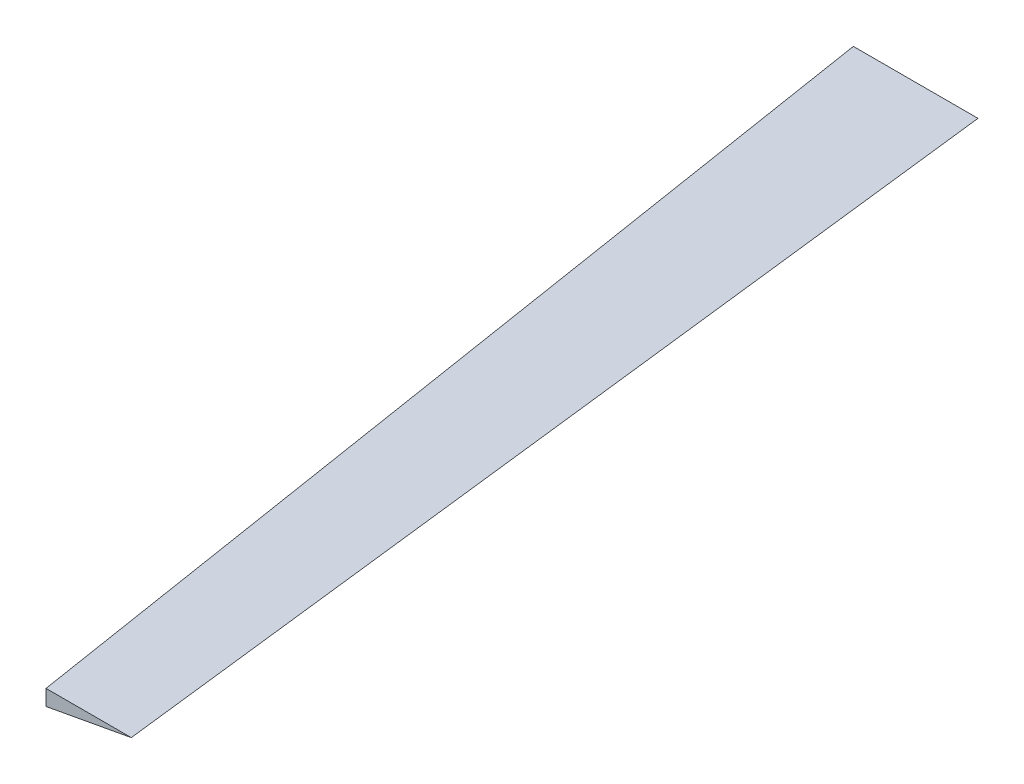
ISO-10303-21;
HEADER;
FILE_DESCRIPTION(('STEP AP214'),'2;1');
FILE_NAME('part.step','',(''),(''),'','','');
FILE_SCHEMA(('AUTOMOTIVE_DESIGN { 1 0 10303 214 1 1 1 1 }'));
ENDSEC;
DATA;
#1=APPLICATION_CONTEXT('core data for automotive mechanical design processes');
#2=APPLICATION_PROTOCOL_DEFINITION('international standard','automotive_design',2000,#1);
#3=PRODUCT_CONTEXT('',#1,'mechanical');
#4=PRODUCT('Part','Part','',(#3));
#5=PRODUCT_RELATED_PRODUCT_CATEGORY('part','',(#4));
#6=PRODUCT_DEFINITION_FORMATION('','',#4);
#7=PRODUCT_DEFINITION_CONTEXT('part definition',#1,'design');
#8=PRODUCT_DEFINITION('design','',#6,#7);
#9=PRODUCT_DEFINITION_SHAPE('','',#8);
#10=(LENGTH_UNIT() NAMED_UNIT(*) SI_UNIT(.MILLI.,.METRE.));
#11=(NAMED_UNIT(*) PLANE_ANGLE_UNIT() SI_UNIT($,.RADIAN.));
#12=(NAMED_UNIT(*) SI_UNIT($,.STERADIAN.) SOLID_ANGLE_UNIT());
#13=UNCERTAINTY_MEASURE_WITH_UNIT(LENGTH_MEASURE(1.E-05),#10,'distance_accuracy_value','');
#14=(GEOMETRIC_REPRESENTATION_CONTEXT(3) GLOBAL_UNCERTAINTY_ASSIGNED_CONTEXT((#13)) GLOBAL_UNIT_ASSIGNED_CONTEXT((#10,
#11,#12)) REPRESENTATION_CONTEXT('',''));
#15=CARTESIAN_POINT('',(0.,0.,0.));
#16=DIRECTION('',(0.,0.,1.));
#17=DIRECTION('',(1.,0.,0.));
#18=AXIS2_PLACEMENT_3D('',#15,#16,#17);
#19=CARTESIAN_POINT('',(0.,0.,-637.5));
#20=DIRECTION('',(0.,0.,1.));
#21=DIRECTION('',(1.,0.,0.));
#22=AXIS2_PLACEMENT_3D('',#19,#20,#21);
#23=PLANE('',#22);
#24=DIRECTION('',(-1.,0.,0.));
#25=VECTOR('',#24,1.);
#26=CARTESIAN_POINT('',(-18.379061036375,0.,-637.5));
#27=LINE('',#26,#25);
#28=CARTESIAN_POINT('',(-18.379061036375,0.,-637.5));
#29=VERTEX_POINT('',#28);
#30=CARTESIAN_POINT('',(-101.183893975277,0.,-637.5));
#31=VERTEX_POINT('',#30);
#32=EDGE_CURVE('E113',#29,#31,#27,.T.);
#33=ORIENTED_EDGE('',*,*,#32,.F.);
#34=DIRECTION('',(-0.983734607715049,-0.179628008906515,0.));
#35=VECTOR('',#34,1.);
#36=CARTESIAN_POINT('',(-18.379061036375,0.,-637.5));
#37=LINE('',#36,#35);
#38=CARTESIAN_POINT('',(-101.183893975277,-15.12,-637.5));
#39=VERTEX_POINT('',#38);
#40=EDGE_CURVE('E12',#29,#39,#37,.T.);
#41=ORIENTED_EDGE('',*,*,#40,.T.);
#42=DIRECTION('',(0.,-1.,0.));
#43=VECTOR('',#42,1.);
#44=CARTESIAN_POINT('',(-101.183893975277,0.,-637.5));
#45=LINE('',#44,#43);
#46=EDGE_CURVE('E56',#31,#39,#45,.T.);
#47=ORIENTED_EDGE('',*,*,#46,.F.);
#48=EDGE_LOOP('',(#33,#41,#47));
#49=FACE_BOUND('',#48,.T.);
#50=ADVANCED_FACE('F45',(#49),#23,.F.);
#51=CARTESIAN_POINT('',(0.,0.,0.));
#52=DIRECTION('',(0.,0.,1.));
#53=DIRECTION('',(1.,0.,0.));
#54=AXIS2_PLACEMENT_3D('',#51,#52,#53);
#55=PLANE('',#54);
#56=DIRECTION('',(-1.,0.,0.));
#57=VECTOR('',#56,1.);
#58=CARTESIAN_POINT('',(56.65,0.,0.));
#59=LINE('',#58,#57);
#60=CARTESIAN_POINT('',(56.65,0.,0.));
#61=VERTEX_POINT('',#60);
#62=CARTESIAN_POINT('',(0.,0.,0.));
#63=VERTEX_POINT('',#62);
#64=EDGE_CURVE('E87',#61,#63,#59,.T.);
#65=ORIENTED_EDGE('',*,*,#64,.T.);
#66=DIRECTION('',(0.,-1.,0.));
#67=VECTOR('',#66,1.);
#68=CARTESIAN_POINT('',(0.,0.,0.));
#69=LINE('',#68,#67);
#70=CARTESIAN_POINT('',(0.,-10.42,0.));
#71=VERTEX_POINT('',#70);
#72=EDGE_CURVE('E89',#63,#71,#69,.T.);
#73=ORIENTED_EDGE('',*,*,#72,.T.);
#74=DIRECTION('',(-0.983501178794772,-0.180901717264634,0.));
#75=VECTOR('',#74,1.);
#76=CARTESIAN_POINT('',(56.65,0.,0.));
#77=LINE('',#76,#75);
#78=EDGE_CURVE('E83',#61,#71,#77,.T.);
#79=ORIENTED_EDGE('',*,*,#78,.F.);
#80=EDGE_LOOP('',(#65,#73,#79));
#81=FACE_BOUND('',#80,.T.);
#82=ADVANCED_FACE('F86',(#81),#55,.T.);
#83=CARTESIAN_POINT('',(0.,0.,0.));
#84=DIRECTION('',(-0.987637107269009,0.,0.156757597408559));
#85=DIRECTION('',(0.156757597408559,0.,0.987637107269009));
#86=AXIS2_PLACEMENT_3D('',#83,#84,#85);
#87=PLANE('',#86);
#88=DIRECTION('',(-0.156757597408559,0.,-0.987637107269009));
#89=VECTOR('',#88,1.);
#90=CARTESIAN_POINT('',(0.,0.,0.));
#91=LINE('',#90,#89);
#92=EDGE_CURVE('E96',#63,#31,#91,.T.);
#93=ORIENTED_EDGE('',*,*,#92,.T.);
#94=ORIENTED_EDGE('',*,*,#46,.T.);
#95=DIRECTION('',(-0.156753442021632,-0.00728120996886803,-0.987610926628376));
#96=VECTOR('',#95,1.);
#97=CARTESIAN_POINT('',(0.,-10.42,0.));
#98=LINE('',#97,#96);
#99=EDGE_CURVE('E114',#71,#39,#98,.T.);
#100=ORIENTED_EDGE('',*,*,#99,.F.);
#101=ORIENTED_EDGE('',*,*,#72,.F.);
#102=EDGE_LOOP('',(#93,#94,#100,#101));
#103=FACE_BOUND('',#102,.T.);
#104=ADVANCED_FACE('F135',(#103),#87,.T.);
#105=CARTESIAN_POINT('',(56.65,0.,0.));
#106=CARTESIAN_POINT('',(-18.379061036375,0.,-637.5));
#107=CARTESIAN_POINT('',(47.2083333333333,-1.73666666666667,0.));
#108=CARTESIAN_POINT('',(-32.179866526192,-2.52,-637.5));
#109=CARTESIAN_POINT('',(37.7666666666667,-3.47333333333333,0.));
#110=CARTESIAN_POINT('',(-45.9806720160089,-5.04,-637.5));
#111=CARTESIAN_POINT('',(18.8833333333333,-6.94666666666667,0.));
#112=CARTESIAN_POINT('',(-73.5822829956429,-10.08,-637.5));
#113=CARTESIAN_POINT('',(9.44166666666666,-8.68333333333333,0.));
#114=CARTESIAN_POINT('',(-87.3830884854599,-12.6,-637.5));
#115=CARTESIAN_POINT('',(0.,-10.42,0.));
#116=CARTESIAN_POINT('',(-101.183893975277,-15.12,-637.5));
#117=B_SPLINE_SURFACE_WITH_KNOTS('',3,1,((#105,#106),(#107,#108),(#109,#110),(#111,#112),(#113,
#114),(#115,#116)),.UNSPECIFIED.,.F.,.F.,.F.,(4,2,4),(2,2),(0.,0.5,1.),(0.,1.),.UNSPECIFIED.);
#118=DIRECTION('',(-0.116885902845264,0.,-0.993145349742951));
#119=VECTOR('',#118,1.);
#120=CARTESIAN_POINT('',(56.65,0.,0.));
#121=LINE('',#120,#119);
#122=EDGE_CURVE('E104',#61,#29,#121,.T.);
#123=ORIENTED_EDGE('',*,*,#78,.T.);
#124=ORIENTED_EDGE('',*,*,#99,.T.);
#125=ORIENTED_EDGE('',*,*,#40,.F.);
#126=ORIENTED_EDGE('',*,*,#122,.F.);
#127=EDGE_LOOP('',(#123,#124,#125,#126));
#128=FACE_BOUND('',#127,.T.);
#129=ADVANCED_FACE('F110',(#128),#117,.T.);
#130=CARTESIAN_POINT('',(0.,0.,0.));
#131=DIRECTION('',(0.,1.,0.));
#132=DIRECTION('',(0.,0.,1.));
#133=AXIS2_PLACEMENT_3D('',#130,#131,#132);
#134=PLANE('',#133);
#135=ORIENTED_EDGE('',*,*,#122,.T.);
#136=ORIENTED_EDGE('',*,*,#32,.T.);
#137=ORIENTED_EDGE('',*,*,#92,.F.);
#138=ORIENTED_EDGE('',*,*,#64,.F.);
#139=EDGE_LOOP('',(#135,#136,#137,#138));
#140=FACE_BOUND('',#139,.T.);
#141=ADVANCED_FACE('F103',(#140),#134,.T.);
#142=CLOSED_SHELL('',(#50,#82,#104,#129,#141));
#143=MANIFOLD_SOLID_BREP('B2',#142);
#144=ADVANCED_BREP_SHAPE_REPRESENTATION('',(#18,#143),#14);
#145=SHAPE_DEFINITION_REPRESENTATION(#9,#144);
ENDSEC;
END-ISO-10303-21;
